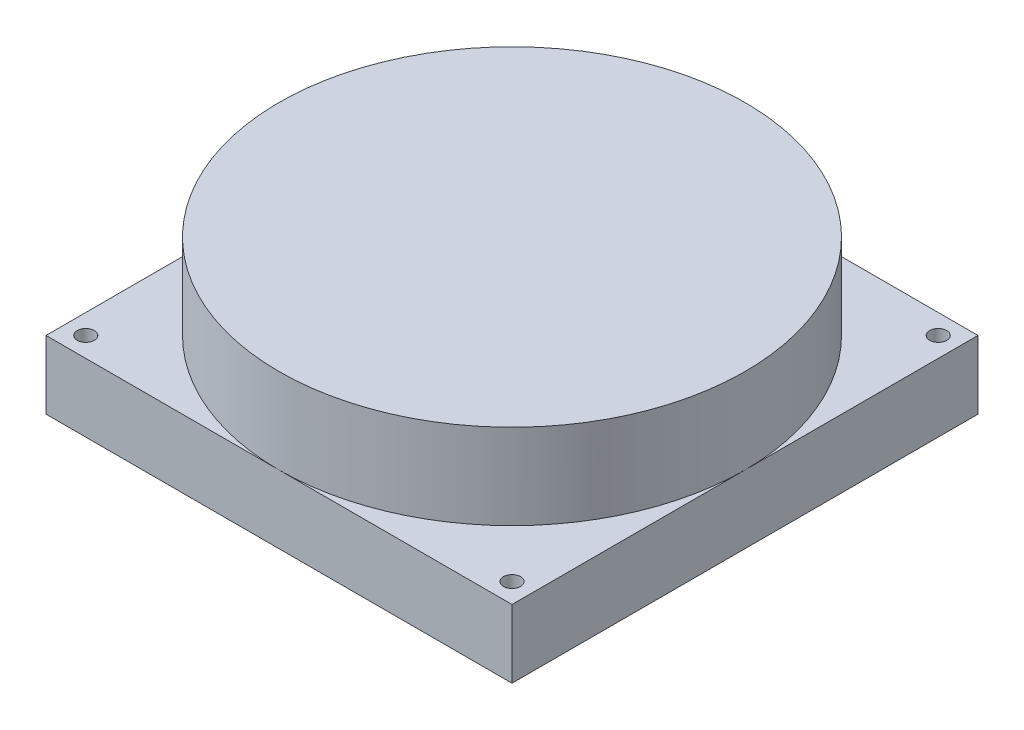
ISO-10303-21;
HEADER;
FILE_DESCRIPTION(('STEP AP214'),'2;1');
FILE_NAME('part.step','',(''),(''),'','','');
FILE_SCHEMA(('AUTOMOTIVE_DESIGN { 1 0 10303 214 1 1 1 1 }'));
ENDSEC;
DATA;
#1=APPLICATION_CONTEXT('core data for automotive mechanical design processes');
#2=APPLICATION_PROTOCOL_DEFINITION('international standard','automotive_design',2000,#1);
#3=PRODUCT_CONTEXT('',#1,'mechanical');
#4=PRODUCT('Part','Part','',(#3));
#5=PRODUCT_RELATED_PRODUCT_CATEGORY('part','',(#4));
#6=PRODUCT_DEFINITION_FORMATION('','',#4);
#7=PRODUCT_DEFINITION_CONTEXT('part definition',#1,'design');
#8=PRODUCT_DEFINITION('design','',#6,#7);
#9=PRODUCT_DEFINITION_SHAPE('','',#8);
#10=(LENGTH_UNIT() NAMED_UNIT(*) SI_UNIT(.MILLI.,.METRE.));
#11=(NAMED_UNIT(*) PLANE_ANGLE_UNIT() SI_UNIT($,.RADIAN.));
#12=(NAMED_UNIT(*) SI_UNIT($,.STERADIAN.) SOLID_ANGLE_UNIT());
#13=UNCERTAINTY_MEASURE_WITH_UNIT(LENGTH_MEASURE(1.E-05),#10,'distance_accuracy_value','');
#14=(GEOMETRIC_REPRESENTATION_CONTEXT(3) GLOBAL_UNCERTAINTY_ASSIGNED_CONTEXT((#13)) GLOBAL_UNIT_ASSIGNED_CONTEXT((#10,
#11,#12)) REPRESENTATION_CONTEXT('',''));
#15=CARTESIAN_POINT('',(0.,0.,0.));
#16=DIRECTION('',(0.,0.,1.));
#17=DIRECTION('',(1.,0.,0.));
#18=AXIS2_PLACEMENT_3D('',#15,#16,#17);
#19=CARTESIAN_POINT('',(0.,12.,0.));
#20=DIRECTION('',(0.,1.,0.));
#21=DIRECTION('',(0.,0.,1.));
#22=AXIS2_PLACEMENT_3D('',#19,#20,#21);
#23=PLANE('',#22);
#24=CARTESIAN_POINT('',(-48.046875,12.,14.6276041666667));
#25=DIRECTION('',(0.,1.,0.));
#26=DIRECTION('',(0.,0.,1.));
#27=AXIS2_PLACEMENT_3D('',#24,#25,#26);
#28=CIRCLE('',#27,41.);
#29=CARTESIAN_POINT('',(-48.046875,12.,55.6276041666667));
#30=VERTEX_POINT('',#29);
#31=CARTESIAN_POINT('',(-7.04687499999999,12.,14.6276041666667));
#32=VERTEX_POINT('',#31);
#33=EDGE_CURVE('E44',#30,#32,#28,.T.);
#34=ORIENTED_EDGE('',*,*,#33,.F.);
#35=DIRECTION('',(1.,0.,0.));
#36=VECTOR('',#35,1.);
#37=CARTESIAN_POINT('',(-89.046875,12.,55.6276041666667));
#38=LINE('',#37,#36);
#39=CARTESIAN_POINT('',(-7.04687499999999,12.,55.6276041666667));
#40=VERTEX_POINT('',#39);
#41=EDGE_CURVE('E99',#30,#40,#38,.T.);
#42=ORIENTED_EDGE('',*,*,#41,.T.);
#43=DIRECTION('',(0.,0.,-1.));
#44=VECTOR('',#43,1.);
#45=CARTESIAN_POINT('',(-7.04687499999999,12.,-26.3723958333333));
#46=LINE('',#45,#44);
#47=EDGE_CURVE('E112',#40,#32,#46,.T.);
#48=ORIENTED_EDGE('',*,*,#47,.T.);
#49=EDGE_LOOP('',(#34,#42,#48));
#50=FACE_BOUND('',#49,.T.);
#51=CARTESIAN_POINT('',(-10.546875,12.,52.1276041666667));
#52=DIRECTION('',(0.,-1.,0.));
#53=DIRECTION('',(0.,0.,-1.));
#54=AXIS2_PLACEMENT_3D('',#51,#52,#53);
#55=CIRCLE('',#54,1.5);
#56=CARTESIAN_POINT('',(-10.546875,12.,50.6276041666667));
#57=VERTEX_POINT('',#56);
#58=EDGE_CURVE('E127',#57,#57,#55,.T.);
#59=ORIENTED_EDGE('',*,*,#58,.T.);
#60=EDGE_LOOP('',(#59));
#61=FACE_BOUND('',#60,.T.);
#62=ADVANCED_FACE('F33',(#50,#61),#23,.T.);
#63=CARTESIAN_POINT('',(-48.046875,12.,-26.3723958333333));
#64=VERTEX_POINT('',#63);
#65=EDGE_CURVE('E11',#32,#64,#28,.T.);
#66=ORIENTED_EDGE('',*,*,#65,.F.);
#67=CARTESIAN_POINT('',(-7.04687499999999,12.,-26.3723958333333));
#68=VERTEX_POINT('',#67);
#69=EDGE_CURVE('E98',#32,#68,#46,.T.);
#70=ORIENTED_EDGE('',*,*,#69,.T.);
#71=DIRECTION('',(-1.,0.,0.));
#72=VECTOR('',#71,1.);
#73=CARTESIAN_POINT('',(-89.046875,12.,-26.3723958333333));
#74=LINE('',#73,#72);
#75=EDGE_CURVE('E148',#68,#64,#74,.T.);
#76=ORIENTED_EDGE('',*,*,#75,.T.);
#77=EDGE_LOOP('',(#66,#70,#76));
#78=FACE_BOUND('',#77,.T.);
#79=CARTESIAN_POINT('',(-10.546875,12.,-22.8723958333333));
#80=DIRECTION('',(0.,-1.,0.));
#81=DIRECTION('',(0.,0.,-1.));
#82=AXIS2_PLACEMENT_3D('',#79,#80,#81);
#83=CIRCLE('',#82,1.5);
#84=CARTESIAN_POINT('',(-10.546875,12.,-24.3723958333333));
#85=VERTEX_POINT('',#84);
#86=EDGE_CURVE('E120',#85,#85,#83,.T.);
#87=ORIENTED_EDGE('',*,*,#86,.T.);
#88=EDGE_LOOP('',(#87));
#89=FACE_BOUND('',#88,.T.);
#90=ADVANCED_FACE('F179',(#78,#89),#23,.T.);
#91=CARTESIAN_POINT('',(-89.046875,12.,14.6276041666667));
#92=VERTEX_POINT('',#91);
#93=EDGE_CURVE('E42',#64,#92,#28,.T.);
#94=ORIENTED_EDGE('',*,*,#93,.F.);
#95=CARTESIAN_POINT('',(-89.046875,12.,-26.3723958333333));
#96=VERTEX_POINT('',#95);
#97=EDGE_CURVE('E147',#64,#96,#74,.T.);
#98=ORIENTED_EDGE('',*,*,#97,.T.);
#99=DIRECTION('',(0.,0.,1.));
#100=VECTOR('',#99,1.);
#101=CARTESIAN_POINT('',(-89.046875,12.,-26.3723958333333));
#102=LINE('',#101,#100);
#103=EDGE_CURVE('E109',#96,#92,#102,.T.);
#104=ORIENTED_EDGE('',*,*,#103,.T.);
#105=EDGE_LOOP('',(#94,#98,#104));
#106=FACE_BOUND('',#105,.T.);
#107=CARTESIAN_POINT('',(-85.546875,12.,-22.8723958333333));
#108=DIRECTION('',(0.,-1.,0.));
#109=DIRECTION('',(0.,0.,-1.));
#110=AXIS2_PLACEMENT_3D('',#107,#108,#109);
#111=CIRCLE('',#110,1.5);
#112=CARTESIAN_POINT('',(-85.546875,12.,-24.3723958333333));
#113=VERTEX_POINT('',#112);
#114=EDGE_CURVE('E134',#113,#113,#111,.T.);
#115=ORIENTED_EDGE('',*,*,#114,.T.);
#116=EDGE_LOOP('',(#115));
#117=FACE_BOUND('',#116,.T.);
#118=ADVANCED_FACE('F177',(#106,#117),#23,.T.);
#119=CARTESIAN_POINT('',(-89.046875,12.,-26.3723958333333));
#120=DIRECTION('',(1.,0.,0.));
#121=DIRECTION('',(0.,0.,-1.));
#122=AXIS2_PLACEMENT_3D('',#119,#120,#121);
#123=PLANE('',#122);
#124=DIRECTION('',(0.,0.,1.));
#125=VECTOR('',#124,1.);
#126=CARTESIAN_POINT('',(-89.046875,0.,-26.3723958333333));
#127=LINE('',#126,#125);
#128=CARTESIAN_POINT('',(-89.046875,0.,-26.3723958333333));
#129=VERTEX_POINT('',#128);
#130=CARTESIAN_POINT('',(-89.046875,0.,55.6276041666667));
#131=VERTEX_POINT('',#130);
#132=EDGE_CURVE('E142',#129,#131,#127,.T.);
#133=ORIENTED_EDGE('',*,*,#132,.T.);
#134=DIRECTION('',(0.,-1.,0.));
#135=VECTOR('',#134,1.);
#136=CARTESIAN_POINT('',(-89.046875,12.,55.6276041666667));
#137=LINE('',#136,#135);
#138=CARTESIAN_POINT('',(-89.046875,12.,55.6276041666667));
#139=VERTEX_POINT('',#138);
#140=EDGE_CURVE('E37',#139,#131,#137,.T.);
#141=ORIENTED_EDGE('',*,*,#140,.F.);
#142=EDGE_CURVE('E94',#92,#139,#102,.T.);
#143=ORIENTED_EDGE('',*,*,#142,.F.);
#144=ORIENTED_EDGE('',*,*,#103,.F.);
#145=DIRECTION('',(0.,-1.,0.));
#146=VECTOR('',#145,1.);
#147=CARTESIAN_POINT('',(-89.046875,12.,-26.3723958333333));
#148=LINE('',#147,#146);
#149=EDGE_CURVE('E150',#96,#129,#148,.T.);
#150=ORIENTED_EDGE('',*,*,#149,.T.);
#151=EDGE_LOOP('',(#133,#141,#143,#144,#150));
#152=FACE_BOUND('',#151,.T.);
#153=ADVANCED_FACE('F35',(#152),#123,.F.);
#154=CARTESIAN_POINT('',(-89.046875,12.,55.6276041666667));
#155=DIRECTION('',(0.,0.,-1.));
#156=DIRECTION('',(-1.,0.,0.));
#157=AXIS2_PLACEMENT_3D('',#154,#155,#156);
#158=PLANE('',#157);
#159=DIRECTION('',(1.,0.,0.));
#160=VECTOR('',#159,1.);
#161=CARTESIAN_POINT('',(-89.046875,0.,55.6276041666667));
#162=LINE('',#161,#160);
#163=CARTESIAN_POINT('',(-7.04687499999999,0.,55.6276041666667));
#164=VERTEX_POINT('',#163);
#165=EDGE_CURVE('E153',#131,#164,#162,.T.);
#166=ORIENTED_EDGE('',*,*,#165,.T.);
#167=DIRECTION('',(0.,-1.,0.));
#168=VECTOR('',#167,1.);
#169=CARTESIAN_POINT('',(-7.04687499999999,12.,55.6276041666667));
#170=LINE('',#169,#168);
#171=EDGE_CURVE('E105',#40,#164,#170,.T.);
#172=ORIENTED_EDGE('',*,*,#171,.F.);
#173=ORIENTED_EDGE('',*,*,#41,.F.);
#174=EDGE_CURVE('E87',#139,#30,#38,.T.);
#175=ORIENTED_EDGE('',*,*,#174,.F.);
#176=ORIENTED_EDGE('',*,*,#140,.T.);
#177=EDGE_LOOP('',(#166,#172,#173,#175,#176));
#178=FACE_BOUND('',#177,.T.);
#179=ADVANCED_FACE('F103',(#178),#158,.F.);
#180=CARTESIAN_POINT('',(-7.04687499999999,12.,-26.3723958333333));
#181=DIRECTION('',(-1.,0.,0.));
#182=DIRECTION('',(0.,0.,1.));
#183=AXIS2_PLACEMENT_3D('',#180,#181,#182);
#184=PLANE('',#183);
#185=DIRECTION('',(0.,0.,-1.));
#186=VECTOR('',#185,1.);
#187=CARTESIAN_POINT('',(-7.04687499999999,0.,-26.3723958333333));
#188=LINE('',#187,#186);
#189=CARTESIAN_POINT('',(-7.04687499999999,0.,-26.3723958333333));
#190=VERTEX_POINT('',#189);
#191=EDGE_CURVE('E155',#164,#190,#188,.T.);
#192=ORIENTED_EDGE('',*,*,#191,.T.);
#193=DIRECTION('',(0.,-1.,0.));
#194=VECTOR('',#193,1.);
#195=CARTESIAN_POINT('',(-7.04687499999999,12.,-26.3723958333333));
#196=LINE('',#195,#194);
#197=EDGE_CURVE('E161',#68,#190,#196,.T.);
#198=ORIENTED_EDGE('',*,*,#197,.F.);
#199=ORIENTED_EDGE('',*,*,#69,.F.);
#200=ORIENTED_EDGE('',*,*,#47,.F.);
#201=ORIENTED_EDGE('',*,*,#171,.T.);
#202=EDGE_LOOP('',(#192,#198,#199,#200,#201));
#203=FACE_BOUND('',#202,.T.);
#204=ADVANCED_FACE('F165',(#203),#184,.F.);
#205=CARTESIAN_POINT('',(-89.046875,12.,-26.3723958333333));
#206=DIRECTION('',(0.,0.,1.));
#207=DIRECTION('',(1.,0.,0.));
#208=AXIS2_PLACEMENT_3D('',#205,#206,#207);
#209=PLANE('',#208);
#210=DIRECTION('',(-1.,0.,0.));
#211=VECTOR('',#210,1.);
#212=CARTESIAN_POINT('',(-89.046875,0.,-26.3723958333333));
#213=LINE('',#212,#211);
#214=EDGE_CURVE('E157',#190,#129,#213,.T.);
#215=ORIENTED_EDGE('',*,*,#214,.T.);
#216=ORIENTED_EDGE('',*,*,#149,.F.);
#217=ORIENTED_EDGE('',*,*,#97,.F.);
#218=ORIENTED_EDGE('',*,*,#75,.F.);
#219=ORIENTED_EDGE('',*,*,#197,.T.);
#220=EDGE_LOOP('',(#215,#216,#217,#218,#219));
#221=FACE_BOUND('',#220,.T.);
#222=ADVANCED_FACE('F173',(#221),#209,.F.);
#223=EDGE_CURVE('E92',#92,#30,#28,.T.);
#224=ORIENTED_EDGE('',*,*,#223,.F.);
#225=ORIENTED_EDGE('',*,*,#142,.T.);
#226=ORIENTED_EDGE('',*,*,#174,.T.);
#227=EDGE_LOOP('',(#224,#225,#226));
#228=FACE_BOUND('',#227,.T.);
#229=CARTESIAN_POINT('',(-85.546875,12.,52.1276041666667));
#230=DIRECTION('',(0.,-1.,0.));
#231=DIRECTION('',(0.,0.,-1.));
#232=AXIS2_PLACEMENT_3D('',#229,#230,#231);
#233=CIRCLE('',#232,1.5);
#234=CARTESIAN_POINT('',(-85.546875,12.,50.6276041666667));
#235=VERTEX_POINT('',#234);
#236=EDGE_CURVE('E139',#235,#235,#233,.T.);
#237=ORIENTED_EDGE('',*,*,#236,.T.);
#238=EDGE_LOOP('',(#237));
#239=FACE_BOUND('',#238,.T.);
#240=ADVANCED_FACE('F89',(#228,#239),#23,.T.);
#241=CARTESIAN_POINT('',(0.,0.,0.));
#242=DIRECTION('',(0.,1.,0.));
#243=DIRECTION('',(0.,0.,1.));
#244=AXIS2_PLACEMENT_3D('',#241,#242,#243);
#245=PLANE('',#244);
#246=CARTESIAN_POINT('',(-57.046875,0.,14.8776041666667));
#247=DIRECTION('',(0.,-1.,0.));
#248=DIRECTION('',(0.,0.,-1.));
#249=AXIS2_PLACEMENT_3D('',#246,#247,#248);
#250=CIRCLE('',#249,1.5);
#251=CARTESIAN_POINT('',(-57.046875,0.,13.3776041666667));
#252=VERTEX_POINT('',#251);
#253=EDGE_CURVE('E366',#252,#252,#250,.T.);
#254=ORIENTED_EDGE('',*,*,#253,.F.);
#255=EDGE_LOOP('',(#254));
#256=FACE_BOUND('',#255,.T.);
#257=CARTESIAN_POINT('',(-39.046875,0.,14.8776041666667));
#258=DIRECTION('',(0.,-1.,0.));
#259=DIRECTION('',(0.,0.,-1.));
#260=AXIS2_PLACEMENT_3D('',#257,#258,#259);
#261=CIRCLE('',#260,1.5);
#262=CARTESIAN_POINT('',(-39.046875,0.,13.3776041666667));
#263=VERTEX_POINT('',#262);
#264=EDGE_CURVE('E373',#263,#263,#261,.T.);
#265=ORIENTED_EDGE('',*,*,#264,.F.);
#266=EDGE_LOOP('',(#265));
#267=FACE_BOUND('',#266,.T.);
#268=CARTESIAN_POINT('',(-10.546875,0.,52.1276041666667));
#269=DIRECTION('',(0.,-1.,0.));
#270=DIRECTION('',(0.,0.,-1.));
#271=AXIS2_PLACEMENT_3D('',#268,#269,#270);
#272=CIRCLE('',#271,1.5);
#273=CARTESIAN_POINT('',(-10.546875,0.,50.6276041666667));
#274=VERTEX_POINT('',#273);
#275=EDGE_CURVE('E131',#274,#274,#272,.T.);
#276=ORIENTED_EDGE('',*,*,#275,.F.);
#277=EDGE_LOOP('',(#276));
#278=FACE_BOUND('',#277,.T.);
#279=CARTESIAN_POINT('',(-85.546875,0.,-22.8723958333333));
#280=DIRECTION('',(0.,-1.,0.));
#281=DIRECTION('',(0.,0.,-1.));
#282=AXIS2_PLACEMENT_3D('',#279,#280,#281);
#283=CIRCLE('',#282,1.5);
#284=CARTESIAN_POINT('',(-85.546875,0.,-24.3723958333333));
#285=VERTEX_POINT('',#284);
#286=EDGE_CURVE('E123',#285,#285,#283,.T.);
#287=ORIENTED_EDGE('',*,*,#286,.F.);
#288=EDGE_LOOP('',(#287));
#289=FACE_BOUND('',#288,.T.);
#290=CARTESIAN_POINT('',(-10.546875,0.,-22.8723958333333));
#291=DIRECTION('',(0.,-1.,0.));
#292=DIRECTION('',(0.,0.,-1.));
#293=AXIS2_PLACEMENT_3D('',#290,#291,#292);
#294=CIRCLE('',#293,1.5);
#295=CARTESIAN_POINT('',(-10.546875,0.,-24.3723958333333));
#296=VERTEX_POINT('',#295);
#297=EDGE_CURVE('E124',#296,#296,#294,.T.);
#298=ORIENTED_EDGE('',*,*,#297,.F.);
#299=EDGE_LOOP('',(#298));
#300=FACE_BOUND('',#299,.T.);
#301=CARTESIAN_POINT('',(-85.546875,0.,52.1276041666667));
#302=DIRECTION('',(0.,-1.,0.));
#303=DIRECTION('',(0.,0.,-1.));
#304=AXIS2_PLACEMENT_3D('',#301,#302,#303);
#305=CIRCLE('',#304,1.5);
#306=CARTESIAN_POINT('',(-85.546875,0.,50.6276041666667));
#307=VERTEX_POINT('',#306);
#308=EDGE_CURVE('E130',#307,#307,#305,.T.);
#309=ORIENTED_EDGE('',*,*,#308,.F.);
#310=EDGE_LOOP('',(#309));
#311=FACE_BOUND('',#310,.T.);
#312=ORIENTED_EDGE('',*,*,#132,.F.);
#313=ORIENTED_EDGE('',*,*,#214,.F.);
#314=ORIENTED_EDGE('',*,*,#191,.F.);
#315=ORIENTED_EDGE('',*,*,#165,.F.);
#316=EDGE_LOOP('',(#312,#313,#314,#315));
#317=FACE_BOUND('',#316,.T.);
#318=ADVANCED_FACE('F170',(#256,#267,#278,#289,#300,#311,#317),#245,.F.);
#319=CARTESIAN_POINT('',(-85.546875,12.,52.1276041666667));
#320=DIRECTION('',(0.,-1.,0.));
#321=DIRECTION('',(0.,0.,-1.));
#322=AXIS2_PLACEMENT_3D('',#319,#320,#321);
#323=CYLINDRICAL_SURFACE('',#322,1.5);
#324=ORIENTED_EDGE('',*,*,#236,.F.);
#325=EDGE_LOOP('',(#324));
#326=FACE_BOUND('',#325,.T.);
#327=ORIENTED_EDGE('',*,*,#308,.T.);
#328=EDGE_LOOP('',(#327));
#329=FACE_BOUND('',#328,.T.);
#330=ADVANCED_FACE('F189',(#326,#329),#323,.F.);
#331=CARTESIAN_POINT('',(-10.546875,12.,-22.8723958333333));
#332=DIRECTION('',(0.,-1.,0.));
#333=DIRECTION('',(0.,0.,-1.));
#334=AXIS2_PLACEMENT_3D('',#331,#332,#333);
#335=CYLINDRICAL_SURFACE('',#334,1.5);
#336=ORIENTED_EDGE('',*,*,#86,.F.);
#337=EDGE_LOOP('',(#336));
#338=FACE_BOUND('',#337,.T.);
#339=ORIENTED_EDGE('',*,*,#297,.T.);
#340=EDGE_LOOP('',(#339));
#341=FACE_BOUND('',#340,.T.);
#342=ADVANCED_FACE('F185',(#338,#341),#335,.F.);
#343=CARTESIAN_POINT('',(-85.546875,12.,-22.8723958333333));
#344=DIRECTION('',(0.,-1.,0.));
#345=DIRECTION('',(0.,0.,-1.));
#346=AXIS2_PLACEMENT_3D('',#343,#344,#345);
#347=CYLINDRICAL_SURFACE('',#346,1.5);
#348=ORIENTED_EDGE('',*,*,#114,.F.);
#349=EDGE_LOOP('',(#348));
#350=FACE_BOUND('',#349,.T.);
#351=ORIENTED_EDGE('',*,*,#286,.T.);
#352=EDGE_LOOP('',(#351));
#353=FACE_BOUND('',#352,.T.);
#354=ADVANCED_FACE('F188',(#350,#353),#347,.F.);
#355=CARTESIAN_POINT('',(-10.546875,12.,52.1276041666667));
#356=DIRECTION('',(0.,-1.,0.));
#357=DIRECTION('',(0.,0.,-1.));
#358=AXIS2_PLACEMENT_3D('',#355,#356,#357);
#359=CYLINDRICAL_SURFACE('',#358,1.5);
#360=ORIENTED_EDGE('',*,*,#58,.F.);
#361=EDGE_LOOP('',(#360));
#362=FACE_BOUND('',#361,.T.);
#363=ORIENTED_EDGE('',*,*,#275,.T.);
#364=EDGE_LOOP('',(#363));
#365=FACE_BOUND('',#364,.T.);
#366=ADVANCED_FACE('F246',(#362,#365),#359,.F.);
#367=CARTESIAN_POINT('',(-48.046875,27.,14.6276041666667));
#368=DIRECTION('',(0.,-1.,0.));
#369=DIRECTION('',(0.,0.,-1.));
#370=AXIS2_PLACEMENT_3D('',#367,#368,#369);
#371=CYLINDRICAL_SURFACE('',#370,41.);
#372=CARTESIAN_POINT('',(-48.046875,27.,14.6276041666667));
#373=DIRECTION('',(0.,1.,0.));
#374=DIRECTION('',(0.,0.,1.));
#375=AXIS2_PLACEMENT_3D('',#372,#373,#374);
#376=CIRCLE('',#375,41.);
#377=CARTESIAN_POINT('',(-48.046875,27.,55.6276041666667));
#378=VERTEX_POINT('',#377);
#379=EDGE_CURVE('E114',#378,#378,#376,.T.);
#380=ORIENTED_EDGE('',*,*,#379,.F.);
#381=EDGE_LOOP('',(#380));
#382=FACE_BOUND('',#381,.T.);
#383=ORIENTED_EDGE('',*,*,#33,.T.);
#384=ORIENTED_EDGE('',*,*,#65,.T.);
#385=ORIENTED_EDGE('',*,*,#93,.T.);
#386=ORIENTED_EDGE('',*,*,#223,.T.);
#387=EDGE_LOOP('',(#383,#384,#385,#386));
#388=FACE_BOUND('',#387,.T.);
#389=ADVANCED_FACE('F116',(#382,#388),#371,.T.);
#390=CARTESIAN_POINT('',(-48.046875,27.,14.6276041666667));
#391=DIRECTION('',(0.,1.,0.));
#392=DIRECTION('',(0.,0.,1.));
#393=AXIS2_PLACEMENT_3D('',#390,#391,#392);
#394=PLANE('',#393);
#395=ORIENTED_EDGE('',*,*,#379,.T.);
#396=EDGE_LOOP('',(#395));
#397=FACE_BOUND('',#396,.T.);
#398=ADVANCED_FACE('F245',(#397),#394,.T.);
#399=CARTESIAN_POINT('',(-39.046875,5.,14.8776041666667));
#400=DIRECTION('',(0.,-1.,0.));
#401=DIRECTION('',(0.,0.,-1.));
#402=AXIS2_PLACEMENT_3D('',#399,#400,#401);
#403=CYLINDRICAL_SURFACE('',#402,1.5);
#404=CARTESIAN_POINT('',(-39.046875,5.,14.8776041666667));
#405=DIRECTION('',(0.,-1.,0.));
#406=DIRECTION('',(0.,0.,-1.));
#407=AXIS2_PLACEMENT_3D('',#404,#405,#406);
#408=CIRCLE('',#407,1.5);
#409=CARTESIAN_POINT('',(-39.046875,5.,13.3776041666667));
#410=VERTEX_POINT('',#409);
#411=EDGE_CURVE('E369',#410,#410,#408,.T.);
#412=ORIENTED_EDGE('',*,*,#411,.F.);
#413=EDGE_LOOP('',(#412));
#414=FACE_BOUND('',#413,.T.);
#415=ORIENTED_EDGE('',*,*,#264,.T.);
#416=EDGE_LOOP('',(#415));
#417=FACE_BOUND('',#416,.T.);
#418=ADVANCED_FACE('F258',(#414,#417),#403,.F.);
#419=CARTESIAN_POINT('',(-39.046875,5.,14.8776041666667));
#420=DIRECTION('',(0.,-1.,0.));
#421=DIRECTION('',(0.,0.,-1.));
#422=AXIS2_PLACEMENT_3D('',#419,#420,#421);
#423=PLANE('',#422);
#424=ORIENTED_EDGE('',*,*,#411,.T.);
#425=EDGE_LOOP('',(#424));
#426=FACE_BOUND('',#425,.T.);
#427=ADVANCED_FACE('F274',(#426),#423,.T.);
#428=CARTESIAN_POINT('',(-57.046875,5.,14.8776041666667));
#429=DIRECTION('',(0.,-1.,0.));
#430=DIRECTION('',(0.,0.,-1.));
#431=AXIS2_PLACEMENT_3D('',#428,#429,#430);
#432=CYLINDRICAL_SURFACE('',#431,1.5);
#433=CARTESIAN_POINT('',(-57.046875,5.,14.8776041666667));
#434=DIRECTION('',(0.,-1.,0.));
#435=DIRECTION('',(0.,0.,-1.));
#436=AXIS2_PLACEMENT_3D('',#433,#434,#435);
#437=CIRCLE('',#436,1.5);
#438=CARTESIAN_POINT('',(-57.046875,5.,13.3776041666667));
#439=VERTEX_POINT('',#438);
#440=EDGE_CURVE('E115',#439,#439,#437,.T.);
#441=ORIENTED_EDGE('',*,*,#440,.F.);
#442=EDGE_LOOP('',(#441));
#443=FACE_BOUND('',#442,.T.);
#444=ORIENTED_EDGE('',*,*,#253,.T.);
#445=EDGE_LOOP('',(#444));
#446=FACE_BOUND('',#445,.T.);
#447=ADVANCED_FACE('F284',(#443,#446),#432,.F.);
#448=CARTESIAN_POINT('',(-57.046875,5.,14.8776041666667));
#449=DIRECTION('',(0.,-1.,0.));
#450=DIRECTION('',(0.,0.,-1.));
#451=AXIS2_PLACEMENT_3D('',#448,#449,#450);
#452=PLANE('',#451);
#453=ORIENTED_EDGE('',*,*,#440,.T.);
#454=EDGE_LOOP('',(#453));
#455=FACE_BOUND('',#454,.T.);
#456=ADVANCED_FACE('F294',(#455),#452,.T.);
#457=CLOSED_SHELL('',(#62,#90,#118,#153,#179,#204,#222,#240,#318,#330,#342,#354,#366,#389,#398,
#418,#427,#447,#456));
#458=MANIFOLD_SOLID_BREP('B2',#457);
#459=ADVANCED_BREP_SHAPE_REPRESENTATION('',(#18,#458),#14);
#460=SHAPE_DEFINITION_REPRESENTATION(#9,#459);
ENDSEC;
END-ISO-10303-21;
